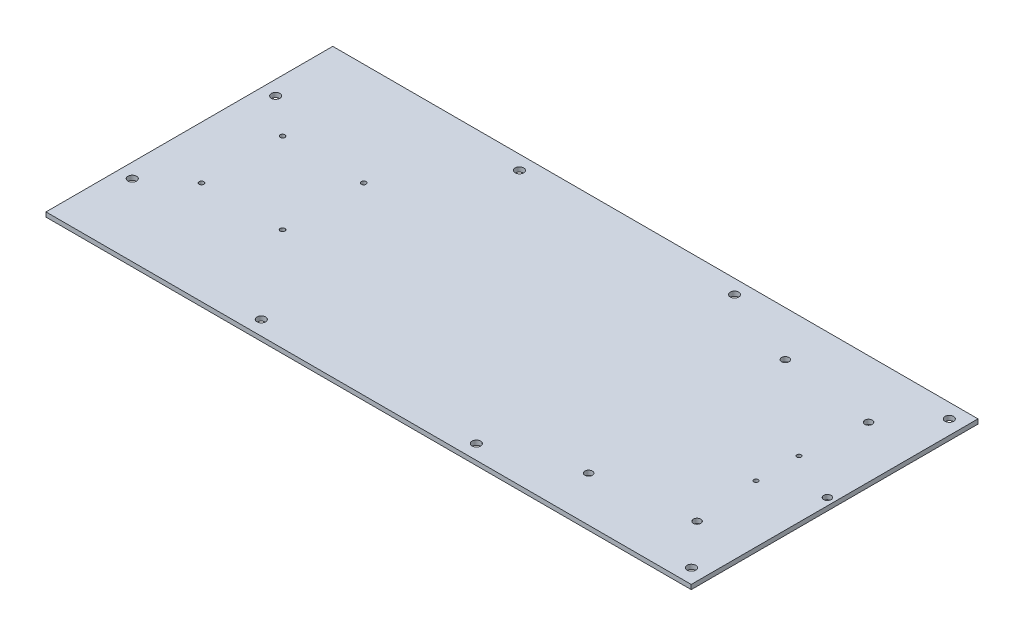
ISO-10303-21;
HEADER;
FILE_DESCRIPTION(('STEP AP214'),'2;1');
FILE_NAME('part.step','',(''),(''),'','','');
FILE_SCHEMA(('AUTOMOTIVE_DESIGN { 1 0 10303 214 1 1 1 1 }'));
ENDSEC;
DATA;
#1=APPLICATION_CONTEXT('core data for automotive mechanical design processes');
#2=APPLICATION_PROTOCOL_DEFINITION('international standard','automotive_design',2000,#1);
#3=PRODUCT_CONTEXT('',#1,'mechanical');
#4=PRODUCT('Part','Part','',(#3));
#5=PRODUCT_RELATED_PRODUCT_CATEGORY('part','',(#4));
#6=PRODUCT_DEFINITION_FORMATION('','',#4);
#7=PRODUCT_DEFINITION_CONTEXT('part definition',#1,'design');
#8=PRODUCT_DEFINITION('design','',#6,#7);
#9=PRODUCT_DEFINITION_SHAPE('','',#8);
#10=(LENGTH_UNIT() NAMED_UNIT(*) SI_UNIT(.MILLI.,.METRE.));
#11=(NAMED_UNIT(*) PLANE_ANGLE_UNIT() SI_UNIT($,.RADIAN.));
#12=(NAMED_UNIT(*) SI_UNIT($,.STERADIAN.) SOLID_ANGLE_UNIT());
#13=UNCERTAINTY_MEASURE_WITH_UNIT(LENGTH_MEASURE(1.E-05),#10,'distance_accuracy_value','');
#14=(GEOMETRIC_REPRESENTATION_CONTEXT(3) GLOBAL_UNCERTAINTY_ASSIGNED_CONTEXT((#13)) GLOBAL_UNIT_ASSIGNED_CONTEXT((#10,
#11,#12)) REPRESENTATION_CONTEXT('',''));
#15=CARTESIAN_POINT('',(0.,0.,0.));
#16=DIRECTION('',(0.,0.,1.));
#17=DIRECTION('',(1.,0.,0.));
#18=AXIS2_PLACEMENT_3D('',#15,#16,#17);
#19=CARTESIAN_POINT('',(0.,3.175,0.));
#20=DIRECTION('',(0.,-1.,0.));
#21=DIRECTION('',(0.,0.,-1.));
#22=AXIS2_PLACEMENT_3D('',#19,#20,#21);
#23=PLANE('',#22);
#24=DIRECTION('',(0.,0.,-1.));
#25=VECTOR('',#24,1.);
#26=CARTESIAN_POINT('',(444.838003203731,3.175,-110.310049741458));
#27=LINE('',#26,#25);
#28=CARTESIAN_POINT('',(444.838003203731,3.175,-110.310049741458));
#29=VERTEX_POINT('',#28);
#30=CARTESIAN_POINT('',(444.838003203731,3.175,-310.310049741458));
#31=VERTEX_POINT('',#30);
#32=EDGE_CURVE('E88',#29,#31,#27,.T.);
#33=ORIENTED_EDGE('',*,*,#32,.T.);
#34=DIRECTION('',(-1.,0.,0.));
#35=VECTOR('',#34,1.);
#36=CARTESIAN_POINT('',(69.8380032037313,3.175,-310.310049741458));
#37=LINE('',#36,#35);
#38=CARTESIAN_POINT('',(-5.16199679626861,3.175,-310.310049741458));
#39=VERTEX_POINT('',#38);
#40=EDGE_CURVE('E82',#31,#39,#37,.T.);
#41=ORIENTED_EDGE('',*,*,#40,.T.);
#42=DIRECTION('',(0.,0.,1.));
#43=VECTOR('',#42,1.);
#44=CARTESIAN_POINT('',(-5.16199679626861,3.175,-310.310049741458));
#45=LINE('',#44,#43);
#46=CARTESIAN_POINT('',(-5.16199679626861,3.175,-110.310049741458));
#47=VERTEX_POINT('',#46);
#48=EDGE_CURVE('E85',#39,#47,#45,.T.);
#49=ORIENTED_EDGE('',*,*,#48,.T.);
#50=DIRECTION('',(1.,0.,0.));
#51=VECTOR('',#50,1.);
#52=CARTESIAN_POINT('',(64.8380032037314,3.175,-110.310049741458));
#53=LINE('',#52,#51);
#54=EDGE_CURVE('E54',#47,#29,#53,.T.);
#55=ORIENTED_EDGE('',*,*,#54,.T.);
#56=EDGE_LOOP('',(#33,#41,#49,#55));
#57=FACE_BOUND('',#56,.T.);
#58=CARTESIAN_POINT('',(439.840442188354,3.175,-210.310049741458));
#59=DIRECTION('',(0.,1.,0.));
#60=DIRECTION('',(0.,0.,1.));
#61=AXIS2_PLACEMENT_3D('',#58,#59,#60);
#62=CIRCLE('',#61,2.60000000000001);
#63=CARTESIAN_POINT('',(439.840442188354,3.175,-207.710049741458));
#64=VERTEX_POINT('',#63);
#65=EDGE_CURVE('E105',#64,#64,#62,.T.);
#66=ORIENTED_EDGE('',*,*,#65,.F.);
#67=EDGE_LOOP('',(#66));
#68=FACE_BOUND('',#67,.T.);
#69=CARTESIAN_POINT('',(404.838003203732,3.175,-225.468098834596));
#70=DIRECTION('',(0.,1.,0.));
#71=DIRECTION('',(0.,0.,1.));
#72=AXIS2_PLACEMENT_3D('',#69,#70,#71);
#73=CIRCLE('',#72,1.50000000000002);
#74=CARTESIAN_POINT('',(404.838003203732,3.175,-223.968098834596));
#75=VERTEX_POINT('',#74);
#76=EDGE_CURVE('E117',#75,#75,#73,.T.);
#77=ORIENTED_EDGE('',*,*,#76,.F.);
#78=EDGE_LOOP('',(#77));
#79=FACE_BOUND('',#78,.T.);
#80=CARTESIAN_POINT('',(404.838003203732,3.175,-195.468098834596));
#81=DIRECTION('',(0.,1.,0.));
#82=DIRECTION('',(0.,0.,1.));
#83=AXIS2_PLACEMENT_3D('',#80,#81,#82);
#84=CIRCLE('',#83,1.50000000000002);
#85=CARTESIAN_POINT('',(404.838003203732,3.175,-193.968098834596));
#86=VERTEX_POINT('',#85);
#87=EDGE_CURVE('E123',#86,#86,#84,.T.);
#88=ORIENTED_EDGE('',*,*,#87,.F.);
#89=EDGE_LOOP('',(#88));
#90=FACE_BOUND('',#89,.T.);
#91=CARTESIAN_POINT('',(4.83800320373137,3.175,-260.468098834596));
#92=DIRECTION('',(0.,1.,0.));
#93=DIRECTION('',(0.,0.,1.));
#94=AXIS2_PLACEMENT_3D('',#91,#92,#93);
#95=CIRCLE('',#94,3.);
#96=CARTESIAN_POINT('',(4.83800320373137,3.175,-257.468098834596));
#97=VERTEX_POINT('',#96);
#98=EDGE_CURVE('E129',#97,#97,#95,.T.);
#99=ORIENTED_EDGE('',*,*,#98,.F.);
#100=EDGE_LOOP('',(#99));
#101=FACE_BOUND('',#100,.T.);
#102=CARTESIAN_POINT('',(408.711521830195,3.175,-150.51195061861));
#103=DIRECTION('',(0.,1.,0.));
#104=DIRECTION('',(0.,0.,1.));
#105=AXIS2_PLACEMENT_3D('',#102,#103,#104);
#106=CIRCLE('',#105,2.60000000000001);
#107=CARTESIAN_POINT('',(408.711521830195,3.175,-147.91195061861));
#108=VERTEX_POINT('',#107);
#109=EDGE_CURVE('E135',#108,#108,#106,.T.);
#110=ORIENTED_EDGE('',*,*,#109,.F.);
#111=EDGE_LOOP('',(#110));
#112=FACE_BOUND('',#111,.T.);
#113=CARTESIAN_POINT('',(434.838003203731,3.175,-300.310049741458));
#114=DIRECTION('',(0.,1.,0.));
#115=DIRECTION('',(0.,0.,1.));
#116=AXIS2_PLACEMENT_3D('',#113,#114,#115);
#117=CIRCLE('',#116,2.99999999999999);
#118=CARTESIAN_POINT('',(434.838003203731,3.175,-297.310049741458));
#119=VERTEX_POINT('',#118);
#120=EDGE_CURVE('E141',#119,#119,#117,.T.);
#121=ORIENTED_EDGE('',*,*,#120,.F.);
#122=EDGE_LOOP('',(#121));
#123=FACE_BOUND('',#122,.T.);
#124=CARTESIAN_POINT('',(134.838003203731,3.175,-300.468098834596));
#125=DIRECTION('',(0.,1.,0.));
#126=DIRECTION('',(0.,0.,1.));
#127=AXIS2_PLACEMENT_3D('',#124,#125,#126);
#128=CIRCLE('',#127,2.99999999999999);
#129=CARTESIAN_POINT('',(134.838003203731,3.175,-297.468098834596));
#130=VERTEX_POINT('',#129);
#131=EDGE_CURVE('E147',#130,#130,#128,.T.);
#132=ORIENTED_EDGE('',*,*,#131,.F.);
#133=EDGE_LOOP('',(#132));
#134=FACE_BOUND('',#133,.T.);
#135=CARTESIAN_POINT('',(31.5537319562695,3.175,-238.59432098892));
#136=DIRECTION('',(0.,1.,0.));
#137=DIRECTION('',(0.,0.,1.));
#138=AXIS2_PLACEMENT_3D('',#135,#136,#137);
#139=CIRCLE('',#138,1.65000000000001);
#140=CARTESIAN_POINT('',(31.5537319562695,3.175,-236.94432098892));
#141=VERTEX_POINT('',#140);
#142=EDGE_CURVE('E153',#141,#141,#139,.T.);
#143=ORIENTED_EDGE('',*,*,#142,.F.);
#144=EDGE_LOOP('',(#143));
#145=FACE_BOUND('',#144,.T.);
#146=CARTESIAN_POINT('',(284.838092310133,3.175,-300.473548709329));
#147=DIRECTION('',(0.,1.,0.));
#148=DIRECTION('',(0.,0.,1.));
#149=AXIS2_PLACEMENT_3D('',#146,#147,#148);
#150=CIRCLE('',#149,2.99999999999999);
#151=CARTESIAN_POINT('',(284.838092310133,3.175,-297.473548709329));
#152=VERTEX_POINT('',#151);
#153=EDGE_CURVE('E159',#152,#152,#150,.T.);
#154=ORIENTED_EDGE('',*,*,#153,.F.);
#155=EDGE_LOOP('',(#154));
#156=FACE_BOUND('',#155,.T.);
#157=CARTESIAN_POINT('',(434.838003203732,3.175,-120.468098834596));
#158=DIRECTION('',(0.,1.,0.));
#159=DIRECTION('',(0.,0.,-1.));
#160=AXIS2_PLACEMENT_3D('',#157,#158,#159);
#161=CIRCLE('',#160,2.99999999999999);
#162=CARTESIAN_POINT('',(434.838003203732,3.175,-123.468098834596));
#163=VERTEX_POINT('',#162);
#164=EDGE_CURVE('E165',#163,#163,#161,.T.);
#165=ORIENTED_EDGE('',*,*,#164,.F.);
#166=EDGE_LOOP('',(#165));
#167=FACE_BOUND('',#166,.T.);
#168=CARTESIAN_POINT('',(284.838003203732,3.175,-120.468098834596));
#169=DIRECTION('',(0.,1.,0.));
#170=DIRECTION('',(0.,0.,-1.));
#171=AXIS2_PLACEMENT_3D('',#168,#169,#170);
#172=CIRCLE('',#171,2.99999999999999);
#173=CARTESIAN_POINT('',(284.838003203732,3.175,-123.468098834596));
#174=VERTEX_POINT('',#173);
#175=EDGE_CURVE('E171',#174,#174,#172,.T.);
#176=ORIENTED_EDGE('',*,*,#175,.F.);
#177=EDGE_LOOP('',(#176));
#178=FACE_BOUND('',#177,.T.);
#179=CARTESIAN_POINT('',(134.838003203731,3.175,-120.468098834596));
#180=DIRECTION('',(0.,1.,0.));
#181=DIRECTION('',(0.,0.,-1.));
#182=AXIS2_PLACEMENT_3D('',#179,#180,#181);
#183=CIRCLE('',#182,2.99999999999999);
#184=CARTESIAN_POINT('',(134.838003203731,3.175,-123.468098834596));
#185=VERTEX_POINT('',#184);
#186=EDGE_CURVE('E177',#185,#185,#183,.T.);
#187=ORIENTED_EDGE('',*,*,#186,.F.);
#188=EDGE_LOOP('',(#187));
#189=FACE_BOUND('',#188,.T.);
#190=CARTESIAN_POINT('',(88.1222744511934,3.175,-238.594320988921));
#191=DIRECTION('',(0.,1.,0.));
#192=DIRECTION('',(0.,0.,1.));
#193=AXIS2_PLACEMENT_3D('',#190,#191,#192);
#194=CIRCLE('',#193,1.65000000000002);
#195=CARTESIAN_POINT('',(88.1222744511934,3.175,-236.944320988921));
#196=VERTEX_POINT('',#195);
#197=EDGE_CURVE('E183',#196,#196,#194,.T.);
#198=ORIENTED_EDGE('',*,*,#197,.F.);
#199=EDGE_LOOP('',(#198));
#200=FACE_BOUND('',#199,.T.);
#201=CARTESIAN_POINT('',(4.83800320373139,3.175,-160.468098834596));
#202=DIRECTION('',(0.,1.,0.));
#203=DIRECTION('',(0.,0.,-1.));
#204=AXIS2_PLACEMENT_3D('',#201,#202,#203);
#205=CIRCLE('',#204,3.);
#206=CARTESIAN_POINT('',(4.83800320373139,3.175,-163.468098834596));
#207=VERTEX_POINT('',#206);
#208=EDGE_CURVE('E189',#207,#207,#205,.T.);
#209=ORIENTED_EDGE('',*,*,#208,.F.);
#210=EDGE_LOOP('',(#209));
#211=FACE_BOUND('',#210,.T.);
#212=CARTESIAN_POINT('',(341.872971694415,3.175,-141.712488660807));
#213=DIRECTION('',(0.,1.,0.));
#214=DIRECTION('',(0.,0.,1.));
#215=AXIS2_PLACEMENT_3D('',#212,#213,#214);
#216=CIRCLE('',#215,2.60000000000001);
#217=CARTESIAN_POINT('',(341.872971694415,3.175,-139.112488660807));
#218=VERTEX_POINT('',#217);
#219=EDGE_CURVE('E195',#218,#218,#216,.T.);
#220=ORIENTED_EDGE('',*,*,#219,.F.);
#221=EDGE_LOOP('',(#220));
#222=FACE_BOUND('',#221,.T.);
#223=CARTESIAN_POINT('',(408.71152204198,3.175,-270.108148974555));
#224=DIRECTION('',(0.,1.,0.));
#225=DIRECTION('',(0.,0.,1.));
#226=AXIS2_PLACEMENT_3D('',#223,#224,#225);
#227=CIRCLE('',#226,2.60000000000001);
#228=CARTESIAN_POINT('',(408.71152204198,3.175,-267.508148974555));
#229=VERTEX_POINT('',#228);
#230=EDGE_CURVE('E201',#229,#229,#227,.T.);
#231=ORIENTED_EDGE('',*,*,#230,.F.);
#232=EDGE_LOOP('',(#231));
#233=FACE_BOUND('',#232,.T.);
#234=CARTESIAN_POINT('',(88.1222744511939,3.175,-182.025778493997));
#235=DIRECTION('',(0.,1.,0.));
#236=DIRECTION('',(0.,0.,1.));
#237=AXIS2_PLACEMENT_3D('',#234,#235,#236);
#238=CIRCLE('',#237,1.65000000000002);
#239=CARTESIAN_POINT('',(88.1222744511939,3.175,-180.375778493997));
#240=VERTEX_POINT('',#239);
#241=EDGE_CURVE('E207',#240,#240,#238,.T.);
#242=ORIENTED_EDGE('',*,*,#241,.F.);
#243=EDGE_LOOP('',(#242));
#244=FACE_BOUND('',#243,.T.);
#245=CARTESIAN_POINT('',(341.872971725579,3.175,-278.907611058824));
#246=DIRECTION('',(0.,1.,0.));
#247=DIRECTION('',(0.,0.,1.));
#248=AXIS2_PLACEMENT_3D('',#245,#246,#247);
#249=CIRCLE('',#248,2.60000000000001);
#250=CARTESIAN_POINT('',(341.872971725579,3.175,-276.307611058824));
#251=VERTEX_POINT('',#250);
#252=EDGE_CURVE('E213',#251,#251,#249,.T.);
#253=ORIENTED_EDGE('',*,*,#252,.F.);
#254=EDGE_LOOP('',(#253));
#255=FACE_BOUND('',#254,.T.);
#256=CARTESIAN_POINT('',(31.5537319562699,3.175,-182.025778493997));
#257=DIRECTION('',(0.,1.,0.));
#258=DIRECTION('',(0.,0.,1.));
#259=AXIS2_PLACEMENT_3D('',#256,#257,#258);
#260=CIRCLE('',#259,1.65000000000001);
#261=CARTESIAN_POINT('',(31.5537319562699,3.175,-180.375778493997));
#262=VERTEX_POINT('',#261);
#263=EDGE_CURVE('E219',#262,#262,#260,.T.);
#264=ORIENTED_EDGE('',*,*,#263,.F.);
#265=EDGE_LOOP('',(#264));
#266=FACE_BOUND('',#265,.T.);
#267=ADVANCED_FACE('F37',(#57,#68,#79,#90,#101,#112,#123,#134,#145,#156,#167,#178,#189,#200,
#211,#222,#233,#244,#255,#266),#23,.F.);
#268=CARTESIAN_POINT('',(0.,0.,0.));
#269=DIRECTION('',(0.,-1.,0.));
#270=DIRECTION('',(0.,0.,-1.));
#271=AXIS2_PLACEMENT_3D('',#268,#269,#270);
#272=PLANE('',#271);
#273=CARTESIAN_POINT('',(341.872971725579,0.,-278.907611058824));
#274=DIRECTION('',(0.,1.,0.));
#275=DIRECTION('',(0.,0.,1.));
#276=AXIS2_PLACEMENT_3D('',#273,#274,#275);
#277=CIRCLE('',#276,2.60000000000001);
#278=CARTESIAN_POINT('',(341.872971725579,0.,-276.307611058824));
#279=VERTEX_POINT('',#278);
#280=EDGE_CURVE('E216',#279,#279,#277,.T.);
#281=ORIENTED_EDGE('',*,*,#280,.T.);
#282=EDGE_LOOP('',(#281));
#283=FACE_BOUND('',#282,.T.);
#284=CARTESIAN_POINT('',(408.71152204198,0.,-270.108148974555));
#285=DIRECTION('',(0.,1.,0.));
#286=DIRECTION('',(0.,0.,1.));
#287=AXIS2_PLACEMENT_3D('',#284,#285,#286);
#288=CIRCLE('',#287,2.60000000000001);
#289=CARTESIAN_POINT('',(408.71152204198,0.,-267.508148974555));
#290=VERTEX_POINT('',#289);
#291=EDGE_CURVE('E204',#290,#290,#288,.T.);
#292=ORIENTED_EDGE('',*,*,#291,.T.);
#293=EDGE_LOOP('',(#292));
#294=FACE_BOUND('',#293,.T.);
#295=CARTESIAN_POINT('',(4.83800320373139,0.,-160.468098834596));
#296=DIRECTION('',(0.,1.,0.));
#297=DIRECTION('',(0.,0.,-1.));
#298=AXIS2_PLACEMENT_3D('',#295,#296,#297);
#299=CIRCLE('',#298,3.);
#300=CARTESIAN_POINT('',(4.83800320373139,0.,-163.468098834596));
#301=VERTEX_POINT('',#300);
#302=EDGE_CURVE('E192',#301,#301,#299,.T.);
#303=ORIENTED_EDGE('',*,*,#302,.T.);
#304=EDGE_LOOP('',(#303));
#305=FACE_BOUND('',#304,.T.);
#306=CARTESIAN_POINT('',(134.838003203731,0.,-120.468098834596));
#307=DIRECTION('',(0.,1.,0.));
#308=DIRECTION('',(0.,0.,-1.));
#309=AXIS2_PLACEMENT_3D('',#306,#307,#308);
#310=CIRCLE('',#309,2.99999999999999);
#311=CARTESIAN_POINT('',(134.838003203731,0.,-123.468098834596));
#312=VERTEX_POINT('',#311);
#313=EDGE_CURVE('E180',#312,#312,#310,.T.);
#314=ORIENTED_EDGE('',*,*,#313,.T.);
#315=EDGE_LOOP('',(#314));
#316=FACE_BOUND('',#315,.T.);
#317=CARTESIAN_POINT('',(434.838003203732,0.,-120.468098834596));
#318=DIRECTION('',(0.,1.,0.));
#319=DIRECTION('',(0.,0.,-1.));
#320=AXIS2_PLACEMENT_3D('',#317,#318,#319);
#321=CIRCLE('',#320,2.99999999999999);
#322=CARTESIAN_POINT('',(434.838003203732,0.,-123.468098834596));
#323=VERTEX_POINT('',#322);
#324=EDGE_CURVE('E168',#323,#323,#321,.T.);
#325=ORIENTED_EDGE('',*,*,#324,.T.);
#326=EDGE_LOOP('',(#325));
#327=FACE_BOUND('',#326,.T.);
#328=CARTESIAN_POINT('',(31.5537319562695,0.,-238.59432098892));
#329=DIRECTION('',(0.,1.,0.));
#330=DIRECTION('',(0.,0.,1.));
#331=AXIS2_PLACEMENT_3D('',#328,#329,#330);
#332=CIRCLE('',#331,1.65000000000001);
#333=CARTESIAN_POINT('',(31.5537319562695,0.,-236.94432098892));
#334=VERTEX_POINT('',#333);
#335=EDGE_CURVE('E156',#334,#334,#332,.T.);
#336=ORIENTED_EDGE('',*,*,#335,.T.);
#337=EDGE_LOOP('',(#336));
#338=FACE_BOUND('',#337,.T.);
#339=CARTESIAN_POINT('',(434.838003203731,0.,-300.310049741458));
#340=DIRECTION('',(0.,1.,0.));
#341=DIRECTION('',(0.,0.,1.));
#342=AXIS2_PLACEMENT_3D('',#339,#340,#341);
#343=CIRCLE('',#342,2.99999999999999);
#344=CARTESIAN_POINT('',(434.838003203731,0.,-297.310049741458));
#345=VERTEX_POINT('',#344);
#346=EDGE_CURVE('E144',#345,#345,#343,.T.);
#347=ORIENTED_EDGE('',*,*,#346,.T.);
#348=EDGE_LOOP('',(#347));
#349=FACE_BOUND('',#348,.T.);
#350=CARTESIAN_POINT('',(4.83800320373137,0.,-260.468098834596));
#351=DIRECTION('',(0.,1.,0.));
#352=DIRECTION('',(0.,0.,1.));
#353=AXIS2_PLACEMENT_3D('',#350,#351,#352);
#354=CIRCLE('',#353,3.);
#355=CARTESIAN_POINT('',(4.83800320373137,0.,-257.468098834596));
#356=VERTEX_POINT('',#355);
#357=EDGE_CURVE('E132',#356,#356,#354,.T.);
#358=ORIENTED_EDGE('',*,*,#357,.T.);
#359=EDGE_LOOP('',(#358));
#360=FACE_BOUND('',#359,.T.);
#361=CARTESIAN_POINT('',(404.838003203732,0.,-225.468098834596));
#362=DIRECTION('',(0.,1.,0.));
#363=DIRECTION('',(0.,0.,1.));
#364=AXIS2_PLACEMENT_3D('',#361,#362,#363);
#365=CIRCLE('',#364,1.50000000000002);
#366=CARTESIAN_POINT('',(404.838003203732,0.,-223.968098834596));
#367=VERTEX_POINT('',#366);
#368=EDGE_CURVE('E120',#367,#367,#365,.T.);
#369=ORIENTED_EDGE('',*,*,#368,.T.);
#370=EDGE_LOOP('',(#369));
#371=FACE_BOUND('',#370,.T.);
#372=DIRECTION('',(0.,0.,-1.));
#373=VECTOR('',#372,1.);
#374=CARTESIAN_POINT('',(444.838003203731,0.,-110.310049741458));
#375=LINE('',#374,#373);
#376=CARTESIAN_POINT('',(444.838003203731,0.,-110.310049741458));
#377=VERTEX_POINT('',#376);
#378=CARTESIAN_POINT('',(444.838003203731,0.,-310.310049741458));
#379=VERTEX_POINT('',#378);
#380=EDGE_CURVE('E102',#377,#379,#375,.T.);
#381=ORIENTED_EDGE('',*,*,#380,.F.);
#382=DIRECTION('',(1.,0.,0.));
#383=VECTOR('',#382,1.);
#384=CARTESIAN_POINT('',(64.8380032037314,0.,-110.310049741458));
#385=LINE('',#384,#383);
#386=CARTESIAN_POINT('',(-5.16199679626861,0.,-110.310049741458));
#387=VERTEX_POINT('',#386);
#388=EDGE_CURVE('E71',#387,#377,#385,.T.);
#389=ORIENTED_EDGE('',*,*,#388,.F.);
#390=DIRECTION('',(0.,0.,1.));
#391=VECTOR('',#390,1.);
#392=CARTESIAN_POINT('',(-5.16199679626861,0.,-310.310049741458));
#393=LINE('',#392,#391);
#394=CARTESIAN_POINT('',(-5.16199679626861,0.,-310.310049741458));
#395=VERTEX_POINT('',#394);
#396=EDGE_CURVE('E107',#395,#387,#393,.T.);
#397=ORIENTED_EDGE('',*,*,#396,.F.);
#398=DIRECTION('',(-1.,0.,0.));
#399=VECTOR('',#398,1.);
#400=CARTESIAN_POINT('',(-5.16199679626861,0.,-310.310049741458));
#401=LINE('',#400,#399);
#402=EDGE_CURVE('E93',#379,#395,#401,.T.);
#403=ORIENTED_EDGE('',*,*,#402,.F.);
#404=EDGE_LOOP('',(#381,#389,#397,#403));
#405=FACE_BOUND('',#404,.T.);
#406=CARTESIAN_POINT('',(439.840442188354,0.,-210.310049741458));
#407=DIRECTION('',(0.,1.,0.));
#408=DIRECTION('',(0.,0.,1.));
#409=AXIS2_PLACEMENT_3D('',#406,#407,#408);
#410=CIRCLE('',#409,2.60000000000001);
#411=CARTESIAN_POINT('',(439.840442188354,0.,-207.710049741458));
#412=VERTEX_POINT('',#411);
#413=EDGE_CURVE('E114',#412,#412,#410,.T.);
#414=ORIENTED_EDGE('',*,*,#413,.T.);
#415=EDGE_LOOP('',(#414));
#416=FACE_BOUND('',#415,.T.);
#417=CARTESIAN_POINT('',(404.838003203732,0.,-195.468098834596));
#418=DIRECTION('',(0.,1.,0.));
#419=DIRECTION('',(0.,0.,1.));
#420=AXIS2_PLACEMENT_3D('',#417,#418,#419);
#421=CIRCLE('',#420,1.50000000000002);
#422=CARTESIAN_POINT('',(404.838003203732,0.,-193.968098834596));
#423=VERTEX_POINT('',#422);
#424=EDGE_CURVE('E126',#423,#423,#421,.T.);
#425=ORIENTED_EDGE('',*,*,#424,.T.);
#426=EDGE_LOOP('',(#425));
#427=FACE_BOUND('',#426,.T.);
#428=CARTESIAN_POINT('',(408.711521830195,0.,-150.51195061861));
#429=DIRECTION('',(0.,1.,0.));
#430=DIRECTION('',(0.,0.,1.));
#431=AXIS2_PLACEMENT_3D('',#428,#429,#430);
#432=CIRCLE('',#431,2.60000000000001);
#433=CARTESIAN_POINT('',(408.711521830195,0.,-147.91195061861));
#434=VERTEX_POINT('',#433);
#435=EDGE_CURVE('E138',#434,#434,#432,.T.);
#436=ORIENTED_EDGE('',*,*,#435,.T.);
#437=EDGE_LOOP('',(#436));
#438=FACE_BOUND('',#437,.T.);
#439=CARTESIAN_POINT('',(134.838003203731,0.,-300.468098834596));
#440=DIRECTION('',(0.,1.,0.));
#441=DIRECTION('',(0.,0.,1.));
#442=AXIS2_PLACEMENT_3D('',#439,#440,#441);
#443=CIRCLE('',#442,2.99999999999999);
#444=CARTESIAN_POINT('',(134.838003203731,0.,-297.468098834596));
#445=VERTEX_POINT('',#444);
#446=EDGE_CURVE('E150',#445,#445,#443,.T.);
#447=ORIENTED_EDGE('',*,*,#446,.T.);
#448=EDGE_LOOP('',(#447));
#449=FACE_BOUND('',#448,.T.);
#450=CARTESIAN_POINT('',(284.838092310133,0.,-300.473548709329));
#451=DIRECTION('',(0.,1.,0.));
#452=DIRECTION('',(0.,0.,1.));
#453=AXIS2_PLACEMENT_3D('',#450,#451,#452);
#454=CIRCLE('',#453,2.99999999999999);
#455=CARTESIAN_POINT('',(284.838092310133,0.,-297.473548709329));
#456=VERTEX_POINT('',#455);
#457=EDGE_CURVE('E162',#456,#456,#454,.T.);
#458=ORIENTED_EDGE('',*,*,#457,.T.);
#459=EDGE_LOOP('',(#458));
#460=FACE_BOUND('',#459,.T.);
#461=CARTESIAN_POINT('',(284.838003203732,0.,-120.468098834596));
#462=DIRECTION('',(0.,1.,0.));
#463=DIRECTION('',(0.,0.,-1.));
#464=AXIS2_PLACEMENT_3D('',#461,#462,#463);
#465=CIRCLE('',#464,2.99999999999999);
#466=CARTESIAN_POINT('',(284.838003203732,0.,-123.468098834596));
#467=VERTEX_POINT('',#466);
#468=EDGE_CURVE('E174',#467,#467,#465,.T.);
#469=ORIENTED_EDGE('',*,*,#468,.T.);
#470=EDGE_LOOP('',(#469));
#471=FACE_BOUND('',#470,.T.);
#472=CARTESIAN_POINT('',(88.1222744511934,0.,-238.594320988921));
#473=DIRECTION('',(0.,1.,0.));
#474=DIRECTION('',(0.,0.,1.));
#475=AXIS2_PLACEMENT_3D('',#472,#473,#474);
#476=CIRCLE('',#475,1.65000000000002);
#477=CARTESIAN_POINT('',(88.1222744511934,0.,-236.944320988921));
#478=VERTEX_POINT('',#477);
#479=EDGE_CURVE('E186',#478,#478,#476,.T.);
#480=ORIENTED_EDGE('',*,*,#479,.T.);
#481=EDGE_LOOP('',(#480));
#482=FACE_BOUND('',#481,.T.);
#483=CARTESIAN_POINT('',(341.872971694415,0.,-141.712488660807));
#484=DIRECTION('',(0.,1.,0.));
#485=DIRECTION('',(0.,0.,1.));
#486=AXIS2_PLACEMENT_3D('',#483,#484,#485);
#487=CIRCLE('',#486,2.60000000000001);
#488=CARTESIAN_POINT('',(341.872971694415,0.,-139.112488660807));
#489=VERTEX_POINT('',#488);
#490=EDGE_CURVE('E198',#489,#489,#487,.T.);
#491=ORIENTED_EDGE('',*,*,#490,.T.);
#492=EDGE_LOOP('',(#491));
#493=FACE_BOUND('',#492,.T.);
#494=CARTESIAN_POINT('',(88.1222744511939,0.,-182.025778493997));
#495=DIRECTION('',(0.,1.,0.));
#496=DIRECTION('',(0.,0.,1.));
#497=AXIS2_PLACEMENT_3D('',#494,#495,#496);
#498=CIRCLE('',#497,1.65000000000002);
#499=CARTESIAN_POINT('',(88.1222744511939,0.,-180.375778493997));
#500=VERTEX_POINT('',#499);
#501=EDGE_CURVE('E210',#500,#500,#498,.T.);
#502=ORIENTED_EDGE('',*,*,#501,.T.);
#503=EDGE_LOOP('',(#502));
#504=FACE_BOUND('',#503,.T.);
#505=CARTESIAN_POINT('',(31.5537319562699,0.,-182.025778493997));
#506=DIRECTION('',(0.,1.,0.));
#507=DIRECTION('',(0.,0.,1.));
#508=AXIS2_PLACEMENT_3D('',#505,#506,#507);
#509=CIRCLE('',#508,1.65000000000001);
#510=CARTESIAN_POINT('',(31.5537319562699,0.,-180.375778493997));
#511=VERTEX_POINT('',#510);
#512=EDGE_CURVE('E222',#511,#511,#509,.T.);
#513=ORIENTED_EDGE('',*,*,#512,.T.);
#514=EDGE_LOOP('',(#513));
#515=FACE_BOUND('',#514,.T.);
#516=ADVANCED_FACE('F232',(#283,#294,#305,#316,#327,#338,#349,#360,#371,#405,#416,#427,#438,
#449,#460,#471,#482,#493,#504,#515),#272,.T.);
#517=CARTESIAN_POINT('',(444.838003203731,3.175,-110.310049741458));
#518=DIRECTION('',(-1.,0.,0.));
#519=DIRECTION('',(0.,0.,1.));
#520=AXIS2_PLACEMENT_3D('',#517,#518,#519);
#521=PLANE('',#520);
#522=ORIENTED_EDGE('',*,*,#380,.T.);
#523=DIRECTION('',(0.,-1.,0.));
#524=VECTOR('',#523,1.);
#525=CARTESIAN_POINT('',(444.838003203731,3.175,-310.310049741458));
#526=LINE('',#525,#524);
#527=EDGE_CURVE('E11',#31,#379,#526,.T.);
#528=ORIENTED_EDGE('',*,*,#527,.F.);
#529=ORIENTED_EDGE('',*,*,#32,.F.);
#530=DIRECTION('',(0.,-1.,0.));
#531=VECTOR('',#530,1.);
#532=CARTESIAN_POINT('',(444.838003203731,3.175,-110.310049741458));
#533=LINE('',#532,#531);
#534=EDGE_CURVE('E98',#29,#377,#533,.T.);
#535=ORIENTED_EDGE('',*,*,#534,.T.);
#536=EDGE_LOOP('',(#522,#528,#529,#535));
#537=FACE_BOUND('',#536,.T.);
#538=ADVANCED_FACE('F39',(#537),#521,.F.);
#539=CARTESIAN_POINT('',(-5.16199679626861,3.175,-310.310049741458));
#540=DIRECTION('',(0.,0.,1.));
#541=DIRECTION('',(1.,0.,0.));
#542=AXIS2_PLACEMENT_3D('',#539,#540,#541);
#543=PLANE('',#542);
#544=ORIENTED_EDGE('',*,*,#402,.T.);
#545=DIRECTION('',(0.,-1.,0.));
#546=VECTOR('',#545,1.);
#547=CARTESIAN_POINT('',(-5.16199679626861,3.175,-310.310049741458));
#548=LINE('',#547,#546);
#549=EDGE_CURVE('E46',#39,#395,#548,.T.);
#550=ORIENTED_EDGE('',*,*,#549,.F.);
#551=ORIENTED_EDGE('',*,*,#40,.F.);
#552=ORIENTED_EDGE('',*,*,#527,.T.);
#553=EDGE_LOOP('',(#544,#550,#551,#552));
#554=FACE_BOUND('',#553,.T.);
#555=ADVANCED_FACE('F92',(#554),#543,.F.);
#556=CARTESIAN_POINT('',(-5.16199679626861,3.175,-310.310049741458));
#557=DIRECTION('',(1.,0.,0.));
#558=DIRECTION('',(0.,0.,-1.));
#559=AXIS2_PLACEMENT_3D('',#556,#557,#558);
#560=PLANE('',#559);
#561=ORIENTED_EDGE('',*,*,#396,.T.);
#562=DIRECTION('',(0.,-1.,0.));
#563=VECTOR('',#562,1.);
#564=CARTESIAN_POINT('',(-5.16199679626861,3.175,-110.310049741458));
#565=LINE('',#564,#563);
#566=EDGE_CURVE('E95',#47,#387,#565,.T.);
#567=ORIENTED_EDGE('',*,*,#566,.F.);
#568=ORIENTED_EDGE('',*,*,#48,.F.);
#569=ORIENTED_EDGE('',*,*,#549,.T.);
#570=EDGE_LOOP('',(#561,#567,#568,#569));
#571=FACE_BOUND('',#570,.T.);
#572=ADVANCED_FACE('F96',(#571),#560,.F.);
#573=CARTESIAN_POINT('',(64.8380032037314,3.175,-110.310049741458));
#574=DIRECTION('',(0.,0.,-1.));
#575=DIRECTION('',(-1.,0.,0.));
#576=AXIS2_PLACEMENT_3D('',#573,#574,#575);
#577=PLANE('',#576);
#578=ORIENTED_EDGE('',*,*,#388,.T.);
#579=ORIENTED_EDGE('',*,*,#534,.F.);
#580=ORIENTED_EDGE('',*,*,#54,.F.);
#581=ORIENTED_EDGE('',*,*,#566,.T.);
#582=EDGE_LOOP('',(#578,#579,#580,#581));
#583=FACE_BOUND('',#582,.T.);
#584=ADVANCED_FACE('F111',(#583),#577,.F.);
#585=CARTESIAN_POINT('',(439.840442188354,3.175,-210.310049741458));
#586=DIRECTION('',(0.,-1.,0.));
#587=DIRECTION('',(0.,0.,-1.));
#588=AXIS2_PLACEMENT_3D('',#585,#586,#587);
#589=CYLINDRICAL_SURFACE('',#588,2.60000000000001);
#590=ORIENTED_EDGE('',*,*,#65,.T.);
#591=EDGE_LOOP('',(#590));
#592=FACE_BOUND('',#591,.T.);
#593=ORIENTED_EDGE('',*,*,#413,.F.);
#594=EDGE_LOOP('',(#593));
#595=FACE_BOUND('',#594,.T.);
#596=ADVANCED_FACE('F240',(#592,#595),#589,.F.);
#597=CARTESIAN_POINT('',(404.838003203732,3.175,-225.468098834596));
#598=DIRECTION('',(0.,-1.,0.));
#599=DIRECTION('',(0.,0.,-1.));
#600=AXIS2_PLACEMENT_3D('',#597,#598,#599);
#601=CYLINDRICAL_SURFACE('',#600,1.50000000000002);
#602=ORIENTED_EDGE('',*,*,#76,.T.);
#603=EDGE_LOOP('',(#602));
#604=FACE_BOUND('',#603,.T.);
#605=ORIENTED_EDGE('',*,*,#368,.F.);
#606=EDGE_LOOP('',(#605));
#607=FACE_BOUND('',#606,.T.);
#608=ADVANCED_FACE('F295',(#604,#607),#601,.F.);
#609=CARTESIAN_POINT('',(404.838003203732,3.175,-195.468098834596));
#610=DIRECTION('',(0.,-1.,0.));
#611=DIRECTION('',(0.,0.,-1.));
#612=AXIS2_PLACEMENT_3D('',#609,#610,#611);
#613=CYLINDRICAL_SURFACE('',#612,1.50000000000002);
#614=ORIENTED_EDGE('',*,*,#87,.T.);
#615=EDGE_LOOP('',(#614));
#616=FACE_BOUND('',#615,.T.);
#617=ORIENTED_EDGE('',*,*,#424,.F.);
#618=EDGE_LOOP('',(#617));
#619=FACE_BOUND('',#618,.T.);
#620=ADVANCED_FACE('F304',(#616,#619),#613,.F.);
#621=CARTESIAN_POINT('',(4.83800320373137,3.175,-260.468098834596));
#622=DIRECTION('',(0.,-1.,0.));
#623=DIRECTION('',(0.,0.,-1.));
#624=AXIS2_PLACEMENT_3D('',#621,#622,#623);
#625=CYLINDRICAL_SURFACE('',#624,3.);
#626=ORIENTED_EDGE('',*,*,#98,.T.);
#627=EDGE_LOOP('',(#626));
#628=FACE_BOUND('',#627,.T.);
#629=ORIENTED_EDGE('',*,*,#357,.F.);
#630=EDGE_LOOP('',(#629));
#631=FACE_BOUND('',#630,.T.);
#632=ADVANCED_FACE('F313',(#628,#631),#625,.F.);
#633=CARTESIAN_POINT('',(408.711521830195,3.175,-150.51195061861));
#634=DIRECTION('',(0.,-1.,0.));
#635=DIRECTION('',(0.,0.,-1.));
#636=AXIS2_PLACEMENT_3D('',#633,#634,#635);
#637=CYLINDRICAL_SURFACE('',#636,2.60000000000001);
#638=ORIENTED_EDGE('',*,*,#109,.T.);
#639=EDGE_LOOP('',(#638));
#640=FACE_BOUND('',#639,.T.);
#641=ORIENTED_EDGE('',*,*,#435,.F.);
#642=EDGE_LOOP('',(#641));
#643=FACE_BOUND('',#642,.T.);
#644=ADVANCED_FACE('F323',(#640,#643),#637,.F.);
#645=CARTESIAN_POINT('',(434.838003203731,3.175,-300.310049741458));
#646=DIRECTION('',(0.,-1.,0.));
#647=DIRECTION('',(0.,0.,-1.));
#648=AXIS2_PLACEMENT_3D('',#645,#646,#647);
#649=CYLINDRICAL_SURFACE('',#648,2.99999999999999);
#650=ORIENTED_EDGE('',*,*,#120,.T.);
#651=EDGE_LOOP('',(#650));
#652=FACE_BOUND('',#651,.T.);
#653=ORIENTED_EDGE('',*,*,#346,.F.);
#654=EDGE_LOOP('',(#653));
#655=FACE_BOUND('',#654,.T.);
#656=ADVANCED_FACE('F333',(#652,#655),#649,.F.);
#657=CARTESIAN_POINT('',(134.838003203731,3.175,-300.468098834596));
#658=DIRECTION('',(0.,-1.,0.));
#659=DIRECTION('',(0.,0.,-1.));
#660=AXIS2_PLACEMENT_3D('',#657,#658,#659);
#661=CYLINDRICAL_SURFACE('',#660,2.99999999999999);
#662=ORIENTED_EDGE('',*,*,#131,.T.);
#663=EDGE_LOOP('',(#662));
#664=FACE_BOUND('',#663,.T.);
#665=ORIENTED_EDGE('',*,*,#446,.F.);
#666=EDGE_LOOP('',(#665));
#667=FACE_BOUND('',#666,.T.);
#668=ADVANCED_FACE('F343',(#664,#667),#661,.F.);
#669=CARTESIAN_POINT('',(31.5537319562695,3.175,-238.59432098892));
#670=DIRECTION('',(0.,-1.,0.));
#671=DIRECTION('',(0.,0.,-1.));
#672=AXIS2_PLACEMENT_3D('',#669,#670,#671);
#673=CYLINDRICAL_SURFACE('',#672,1.65000000000001);
#674=ORIENTED_EDGE('',*,*,#142,.T.);
#675=EDGE_LOOP('',(#674));
#676=FACE_BOUND('',#675,.T.);
#677=ORIENTED_EDGE('',*,*,#335,.F.);
#678=EDGE_LOOP('',(#677));
#679=FACE_BOUND('',#678,.T.);
#680=ADVANCED_FACE('F353',(#676,#679),#673,.F.);
#681=CARTESIAN_POINT('',(284.838092310133,3.175,-300.473548709329));
#682=DIRECTION('',(0.,-1.,0.));
#683=DIRECTION('',(0.,0.,-1.));
#684=AXIS2_PLACEMENT_3D('',#681,#682,#683);
#685=CYLINDRICAL_SURFACE('',#684,2.99999999999999);
#686=ORIENTED_EDGE('',*,*,#153,.T.);
#687=EDGE_LOOP('',(#686));
#688=FACE_BOUND('',#687,.T.);
#689=ORIENTED_EDGE('',*,*,#457,.F.);
#690=EDGE_LOOP('',(#689));
#691=FACE_BOUND('',#690,.T.);
#692=ADVANCED_FACE('F363',(#688,#691),#685,.F.);
#693=CARTESIAN_POINT('',(434.838003203732,3.175,-120.468098834596));
#694=DIRECTION('',(0.,-1.,0.));
#695=DIRECTION('',(0.,0.,-1.));
#696=AXIS2_PLACEMENT_3D('',#693,#694,#695);
#697=CYLINDRICAL_SURFACE('',#696,2.99999999999999);
#698=ORIENTED_EDGE('',*,*,#164,.T.);
#699=EDGE_LOOP('',(#698));
#700=FACE_BOUND('',#699,.T.);
#701=ORIENTED_EDGE('',*,*,#324,.F.);
#702=EDGE_LOOP('',(#701));
#703=FACE_BOUND('',#702,.T.);
#704=ADVANCED_FACE('F373',(#700,#703),#697,.F.);
#705=CARTESIAN_POINT('',(284.838003203732,3.175,-120.468098834596));
#706=DIRECTION('',(0.,-1.,0.));
#707=DIRECTION('',(0.,0.,-1.));
#708=AXIS2_PLACEMENT_3D('',#705,#706,#707);
#709=CYLINDRICAL_SURFACE('',#708,2.99999999999999);
#710=ORIENTED_EDGE('',*,*,#175,.T.);
#711=EDGE_LOOP('',(#710));
#712=FACE_BOUND('',#711,.T.);
#713=ORIENTED_EDGE('',*,*,#468,.F.);
#714=EDGE_LOOP('',(#713));
#715=FACE_BOUND('',#714,.T.);
#716=ADVANCED_FACE('F383',(#712,#715),#709,.F.);
#717=CARTESIAN_POINT('',(134.838003203731,3.175,-120.468098834596));
#718=DIRECTION('',(0.,-1.,0.));
#719=DIRECTION('',(0.,0.,-1.));
#720=AXIS2_PLACEMENT_3D('',#717,#718,#719);
#721=CYLINDRICAL_SURFACE('',#720,2.99999999999999);
#722=ORIENTED_EDGE('',*,*,#186,.T.);
#723=EDGE_LOOP('',(#722));
#724=FACE_BOUND('',#723,.T.);
#725=ORIENTED_EDGE('',*,*,#313,.F.);
#726=EDGE_LOOP('',(#725));
#727=FACE_BOUND('',#726,.T.);
#728=ADVANCED_FACE('F393',(#724,#727),#721,.F.);
#729=CARTESIAN_POINT('',(88.1222744511934,3.175,-238.594320988921));
#730=DIRECTION('',(0.,-1.,0.));
#731=DIRECTION('',(0.,0.,-1.));
#732=AXIS2_PLACEMENT_3D('',#729,#730,#731);
#733=CYLINDRICAL_SURFACE('',#732,1.65000000000002);
#734=ORIENTED_EDGE('',*,*,#197,.T.);
#735=EDGE_LOOP('',(#734));
#736=FACE_BOUND('',#735,.T.);
#737=ORIENTED_EDGE('',*,*,#479,.F.);
#738=EDGE_LOOP('',(#737));
#739=FACE_BOUND('',#738,.T.);
#740=ADVANCED_FACE('F403',(#736,#739),#733,.F.);
#741=CARTESIAN_POINT('',(4.83800320373139,3.175,-160.468098834596));
#742=DIRECTION('',(0.,-1.,0.));
#743=DIRECTION('',(0.,0.,-1.));
#744=AXIS2_PLACEMENT_3D('',#741,#742,#743);
#745=CYLINDRICAL_SURFACE('',#744,3.);
#746=ORIENTED_EDGE('',*,*,#208,.T.);
#747=EDGE_LOOP('',(#746));
#748=FACE_BOUND('',#747,.T.);
#749=ORIENTED_EDGE('',*,*,#302,.F.);
#750=EDGE_LOOP('',(#749));
#751=FACE_BOUND('',#750,.T.);
#752=ADVANCED_FACE('F413',(#748,#751),#745,.F.);
#753=CARTESIAN_POINT('',(341.872971694415,3.175,-141.712488660807));
#754=DIRECTION('',(0.,-1.,0.));
#755=DIRECTION('',(0.,0.,-1.));
#756=AXIS2_PLACEMENT_3D('',#753,#754,#755);
#757=CYLINDRICAL_SURFACE('',#756,2.60000000000001);
#758=ORIENTED_EDGE('',*,*,#219,.T.);
#759=EDGE_LOOP('',(#758));
#760=FACE_BOUND('',#759,.T.);
#761=ORIENTED_EDGE('',*,*,#490,.F.);
#762=EDGE_LOOP('',(#761));
#763=FACE_BOUND('',#762,.T.);
#764=ADVANCED_FACE('F423',(#760,#763),#757,.F.);
#765=CARTESIAN_POINT('',(408.71152204198,3.175,-270.108148974555));
#766=DIRECTION('',(0.,-1.,0.));
#767=DIRECTION('',(0.,0.,-1.));
#768=AXIS2_PLACEMENT_3D('',#765,#766,#767);
#769=CYLINDRICAL_SURFACE('',#768,2.60000000000001);
#770=ORIENTED_EDGE('',*,*,#230,.T.);
#771=EDGE_LOOP('',(#770));
#772=FACE_BOUND('',#771,.T.);
#773=ORIENTED_EDGE('',*,*,#291,.F.);
#774=EDGE_LOOP('',(#773));
#775=FACE_BOUND('',#774,.T.);
#776=ADVANCED_FACE('F433',(#772,#775),#769,.F.);
#777=CARTESIAN_POINT('',(88.1222744511939,3.175,-182.025778493997));
#778=DIRECTION('',(0.,-1.,0.));
#779=DIRECTION('',(0.,0.,-1.));
#780=AXIS2_PLACEMENT_3D('',#777,#778,#779);
#781=CYLINDRICAL_SURFACE('',#780,1.65000000000002);
#782=ORIENTED_EDGE('',*,*,#241,.T.);
#783=EDGE_LOOP('',(#782));
#784=FACE_BOUND('',#783,.T.);
#785=ORIENTED_EDGE('',*,*,#501,.F.);
#786=EDGE_LOOP('',(#785));
#787=FACE_BOUND('',#786,.T.);
#788=ADVANCED_FACE('F443',(#784,#787),#781,.F.);
#789=CARTESIAN_POINT('',(341.872971725579,3.175,-278.907611058824));
#790=DIRECTION('',(0.,-1.,0.));
#791=DIRECTION('',(0.,0.,-1.));
#792=AXIS2_PLACEMENT_3D('',#789,#790,#791);
#793=CYLINDRICAL_SURFACE('',#792,2.60000000000001);
#794=ORIENTED_EDGE('',*,*,#252,.T.);
#795=EDGE_LOOP('',(#794));
#796=FACE_BOUND('',#795,.T.);
#797=ORIENTED_EDGE('',*,*,#280,.F.);
#798=EDGE_LOOP('',(#797));
#799=FACE_BOUND('',#798,.T.);
#800=ADVANCED_FACE('F453',(#796,#799),#793,.F.);
#801=CARTESIAN_POINT('',(31.5537319562699,3.175,-182.025778493997));
#802=DIRECTION('',(0.,-1.,0.));
#803=DIRECTION('',(0.,0.,-1.));
#804=AXIS2_PLACEMENT_3D('',#801,#802,#803);
#805=CYLINDRICAL_SURFACE('',#804,1.65000000000001);
#806=ORIENTED_EDGE('',*,*,#263,.T.);
#807=EDGE_LOOP('',(#806));
#808=FACE_BOUND('',#807,.T.);
#809=ORIENTED_EDGE('',*,*,#512,.F.);
#810=EDGE_LOOP('',(#809));
#811=FACE_BOUND('',#810,.T.);
#812=ADVANCED_FACE('F228',(#808,#811),#805,.F.);
#813=CLOSED_SHELL('',(#267,#516,#538,#555,#572,#584,#596,#608,#620,#632,#644,#656,#668,#680,
#692,#704,#716,#728,#740,#752,#764,#776,#788,#800,#812));
#814=MANIFOLD_SOLID_BREP('B2',#813);
#815=ADVANCED_BREP_SHAPE_REPRESENTATION('',(#18,#814),#14);
#816=SHAPE_DEFINITION_REPRESENTATION(#9,#815);
ENDSEC;
END-ISO-10303-21;
